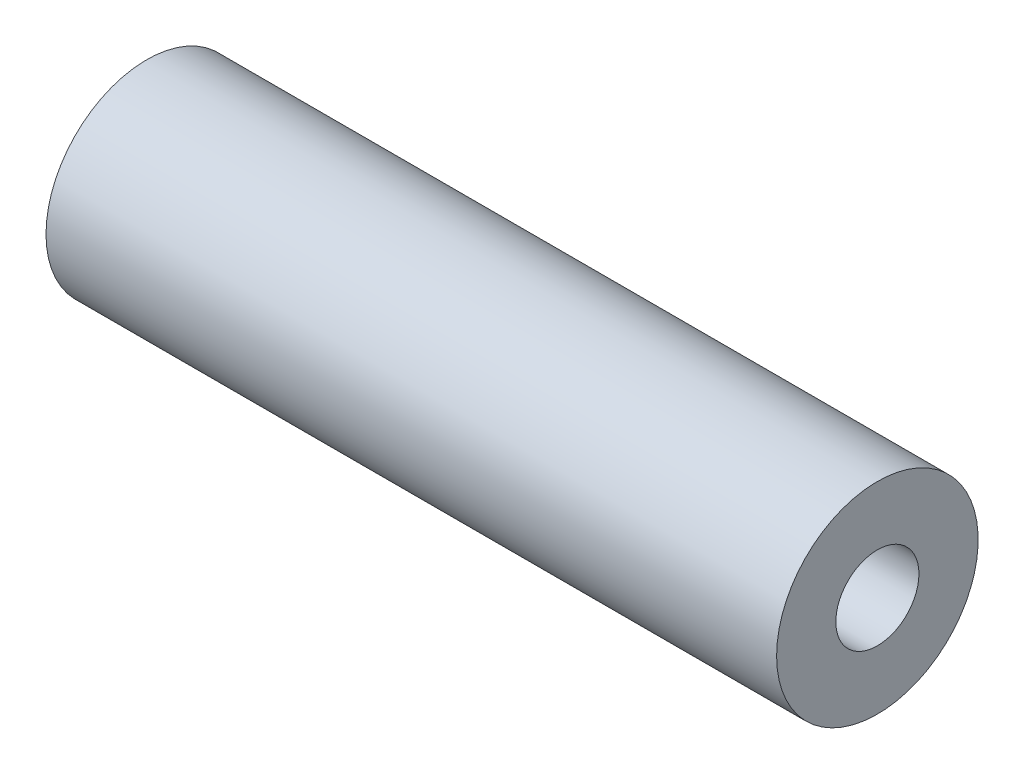
ISO-10303-21;
HEADER;
FILE_DESCRIPTION(('STEP AP214'),'2;1');
FILE_NAME('part.step','',(''),(''),'','','');
FILE_SCHEMA(('AUTOMOTIVE_DESIGN { 1 0 10303 214 1 1 1 1 }'));
ENDSEC;
DATA;
#1=APPLICATION_CONTEXT('core data for automotive mechanical design processes');
#2=APPLICATION_PROTOCOL_DEFINITION('international standard','automotive_design',2000,#1);
#3=PRODUCT_CONTEXT('',#1,'mechanical');
#4=PRODUCT('Part','Part','',(#3));
#5=PRODUCT_RELATED_PRODUCT_CATEGORY('part','',(#4));
#6=PRODUCT_DEFINITION_FORMATION('','',#4);
#7=PRODUCT_DEFINITION_CONTEXT('part definition',#1,'design');
#8=PRODUCT_DEFINITION('design','',#6,#7);
#9=PRODUCT_DEFINITION_SHAPE('','',#8);
#10=(LENGTH_UNIT() NAMED_UNIT(*) SI_UNIT(.MILLI.,.METRE.));
#11=(NAMED_UNIT(*) PLANE_ANGLE_UNIT() SI_UNIT($,.RADIAN.));
#12=(NAMED_UNIT(*) SI_UNIT($,.STERADIAN.) SOLID_ANGLE_UNIT());
#13=UNCERTAINTY_MEASURE_WITH_UNIT(LENGTH_MEASURE(1.E-05),#10,'distance_accuracy_value','');
#14=(GEOMETRIC_REPRESENTATION_CONTEXT(3) GLOBAL_UNCERTAINTY_ASSIGNED_CONTEXT((#13)) GLOBAL_UNIT_ASSIGNED_CONTEXT((#10,
#11,#12)) REPRESENTATION_CONTEXT('',''));
#15=CARTESIAN_POINT('',(0.,0.,0.));
#16=DIRECTION('',(0.,0.,1.));
#17=DIRECTION('',(1.,0.,0.));
#18=AXIS2_PLACEMENT_3D('',#15,#16,#17);
#19=CARTESIAN_POINT('',(14.5,0.,0.));
#20=DIRECTION('',(-1.,0.,0.));
#21=DIRECTION('',(0.,0.,1.));
#22=AXIS2_PLACEMENT_3D('',#19,#20,#21);
#23=CYLINDRICAL_SURFACE('',#22,4.);
#24=CARTESIAN_POINT('',(14.5,0.,0.));
#25=DIRECTION('',(1.,0.,0.));
#26=DIRECTION('',(0.,0.,-1.));
#27=AXIS2_PLACEMENT_3D('',#24,#25,#26);
#28=CIRCLE('',#27,4.);
#29=CARTESIAN_POINT('',(14.5,0.,4.));
#30=VERTEX_POINT('',#29);
#31=EDGE_CURVE('E10',#30,#30,#28,.T.);
#32=CARTESIAN_POINT('',(-14.5,0.,0.));
#33=DIRECTION('',(1.,0.,0.));
#34=DIRECTION('',(0.,0.,-1.));
#35=AXIS2_PLACEMENT_3D('',#32,#33,#34);
#36=CIRCLE('',#35,4.);
#37=CARTESIAN_POINT('',(-14.5,0.,4.));
#38=VERTEX_POINT('',#37);
#39=EDGE_CURVE('E45',#38,#38,#36,.T.);
#40=CARTESIAN_POINT('',(14.5,0.,4.));
#41=CARTESIAN_POINT('',(14.1979166666667,0.,4.));
#42=CARTESIAN_POINT('',(13.8958333333333,0.,4.));
#43=CARTESIAN_POINT('',(13.2916666666667,0.,4.));
#44=CARTESIAN_POINT('',(12.9895833333333,0.,4.));
#45=CARTESIAN_POINT('',(12.3854166666667,0.,4.));
#46=CARTESIAN_POINT('',(12.0833333333333,0.,4.));
#47=CARTESIAN_POINT('',(11.4791666666667,0.,4.));
#48=CARTESIAN_POINT('',(11.1770833333333,0.,4.));
#49=CARTESIAN_POINT('',(10.5729166666667,0.,4.));
#50=CARTESIAN_POINT('',(10.2708333333333,0.,4.));
#51=CARTESIAN_POINT('',(9.66666666666667,0.,4.));
#52=CARTESIAN_POINT('',(9.36458333333333,0.,4.));
#53=CARTESIAN_POINT('',(8.76041666666667,0.,4.));
#54=CARTESIAN_POINT('',(8.45833333333333,0.,4.));
#55=CARTESIAN_POINT('',(7.85416666666667,0.,4.));
#56=CARTESIAN_POINT('',(7.55208333333333,0.,4.));
#57=CARTESIAN_POINT('',(6.94791666666667,0.,4.));
#58=CARTESIAN_POINT('',(6.64583333333333,0.,4.));
#59=CARTESIAN_POINT('',(6.04166666666667,0.,4.));
#60=CARTESIAN_POINT('',(5.73958333333333,0.,4.));
#61=CARTESIAN_POINT('',(5.13541666666667,0.,4.));
#62=CARTESIAN_POINT('',(4.83333333333333,0.,4.));
#63=CARTESIAN_POINT('',(4.22916666666667,0.,4.));
#64=CARTESIAN_POINT('',(3.92708333333333,0.,4.));
#65=CARTESIAN_POINT('',(3.32291666666667,0.,4.));
#66=CARTESIAN_POINT('',(3.02083333333333,0.,4.));
#67=CARTESIAN_POINT('',(2.41666666666667,0.,4.));
#68=CARTESIAN_POINT('',(2.11458333333333,0.,4.));
#69=CARTESIAN_POINT('',(1.51041666666667,0.,4.));
#70=CARTESIAN_POINT('',(1.20833333333333,0.,4.));
#71=CARTESIAN_POINT('',(0.604166666666665,0.,4.));
#72=CARTESIAN_POINT('',(0.302083333333332,0.,4.));
#73=CARTESIAN_POINT('',(-0.302083333333335,0.,4.));
#74=CARTESIAN_POINT('',(-0.604166666666669,0.,4.));
#75=CARTESIAN_POINT('',(-1.20833333333333,0.,4.));
#76=CARTESIAN_POINT('',(-1.51041666666667,0.,4.));
#77=CARTESIAN_POINT('',(-2.11458333333333,0.,4.));
#78=CARTESIAN_POINT('',(-2.41666666666667,0.,4.));
#79=CARTESIAN_POINT('',(-3.02083333333333,0.,4.));
#80=CARTESIAN_POINT('',(-3.32291666666666,0.,4.));
#81=CARTESIAN_POINT('',(-3.92708333333333,0.,4.));
#82=CARTESIAN_POINT('',(-4.22916666666667,0.,4.));
#83=CARTESIAN_POINT('',(-4.83333333333333,0.,4.));
#84=CARTESIAN_POINT('',(-5.13541666666667,0.,4.));
#85=CARTESIAN_POINT('',(-5.73958333333333,0.,4.));
#86=CARTESIAN_POINT('',(-6.04166666666667,0.,4.));
#87=CARTESIAN_POINT('',(-6.64583333333333,0.,4.));
#88=CARTESIAN_POINT('',(-6.94791666666667,0.,4.));
#89=CARTESIAN_POINT('',(-7.55208333333333,0.,4.));
#90=CARTESIAN_POINT('',(-7.85416666666667,0.,4.));
#91=CARTESIAN_POINT('',(-8.45833333333333,0.,4.));
#92=CARTESIAN_POINT('',(-8.76041666666667,0.,4.));
#93=CARTESIAN_POINT('',(-9.36458333333333,0.,4.));
#94=CARTESIAN_POINT('',(-9.66666666666667,0.,4.));
#95=CARTESIAN_POINT('',(-10.2708333333333,0.,4.));
#96=CARTESIAN_POINT('',(-10.5729166666667,0.,4.));
#97=CARTESIAN_POINT('',(-11.1770833333333,0.,4.));
#98=CARTESIAN_POINT('',(-11.4791666666667,0.,4.));
#99=CARTESIAN_POINT('',(-12.0833333333333,0.,4.));
#100=CARTESIAN_POINT('',(-12.3854166666667,0.,4.));
#101=CARTESIAN_POINT('',(-12.9895833333333,0.,4.));
#102=CARTESIAN_POINT('',(-13.2916666666667,0.,4.));
#103=CARTESIAN_POINT('',(-13.8958333333333,0.,4.));
#104=CARTESIAN_POINT('',(-14.1979166666667,0.,4.));
#105=CARTESIAN_POINT('',(-14.5,0.,4.));
#106=B_SPLINE_CURVE_WITH_KNOTS('',3,(#40,#41,#42,#43,#44,#45,#46,#47,#48,#49,#50,#51,#52,#53,
#54,#55,#56,#57,#58,#59,#60,#61,#62,#63,#64,#65,#66,#67,#68,#69,#70,#71,#72,#73,#74,#75,#76,#77,
#78,#79,#80,#81,#82,#83,#84,#85,#86,#87,#88,#89,#90,#91,#92,#93,#94,#95,#96,#97,#98,#99,#100,
#101,#102,#103,#104,#105),.UNSPECIFIED.,.F.,.F.,(4,2,2,2,2,2,2,2,2,2,2,2,2,2,2,2,2,2,2,2,2,2,2,
2,2,2,2,2,2,2,2,2,4),(0.,0.906249999999999,1.8125,2.71875,3.625,4.53125,5.4375,6.34375,7.25,
8.15625,9.0625,9.96875,10.875,11.78125,12.6875,13.59375,14.5,15.40625,16.3125,17.21875,18.125,
19.03125,19.9375,20.84375,21.75,22.65625,23.5625,24.46875,25.375,26.28125,27.1875,28.09375,29.),.UNSPECIFIED.);
#107=EDGE_CURVE('BSEAM42',#30,#38,#106,.T.);
#108=ORIENTED_EDGE('',*,*,#31,.F.);
#109=ORIENTED_EDGE('',*,*,#39,.T.);
#110=ORIENTED_EDGE('',*,*,#107,.T.);
#111=ORIENTED_EDGE('',*,*,#107,.F.);
#112=EDGE_LOOP('',(#108,#110,#109,#111));
#113=FACE_BOUND('',#112,.T.);
#114=ADVANCED_FACE('F42',(#113),#23,.T.);
#115=CARTESIAN_POINT('',(14.5,0.,0.));
#116=DIRECTION('',(1.,0.,0.));
#117=DIRECTION('',(0.,0.,-1.));
#118=AXIS2_PLACEMENT_3D('',#115,#116,#117);
#119=PLANE('',#118);
#120=CARTESIAN_POINT('',(14.5,0.,0.));
#121=DIRECTION('',(1.,0.,0.));
#122=DIRECTION('',(0.,0.,-1.));
#123=AXIS2_PLACEMENT_3D('',#120,#121,#122);
#124=CIRCLE('',#123,1.65);
#125=CARTESIAN_POINT('',(14.5,0.,-1.65));
#126=VERTEX_POINT('',#125);
#127=EDGE_CURVE('E56',#126,#126,#124,.T.);
#128=ORIENTED_EDGE('',*,*,#127,.F.);
#129=EDGE_LOOP('',(#128));
#130=FACE_BOUND('',#129,.T.);
#131=ORIENTED_EDGE('',*,*,#31,.T.);
#132=EDGE_LOOP('',(#131));
#133=FACE_BOUND('',#132,.T.);
#134=ADVANCED_FACE('F62',(#130,#133),#119,.T.);
#135=CARTESIAN_POINT('',(-14.5,0.,0.));
#136=DIRECTION('',(1.,0.,0.));
#137=DIRECTION('',(0.,0.,-1.));
#138=AXIS2_PLACEMENT_3D('',#135,#136,#137);
#139=PLANE('',#138);
#140=CARTESIAN_POINT('',(-14.5,0.,0.));
#141=DIRECTION('',(1.,0.,0.));
#142=DIRECTION('',(0.,0.,-1.));
#143=AXIS2_PLACEMENT_3D('',#140,#141,#142);
#144=CIRCLE('',#143,1.65);
#145=CARTESIAN_POINT('',(-14.5,0.,-1.65));
#146=VERTEX_POINT('',#145);
#147=EDGE_CURVE('E52',#146,#146,#144,.T.);
#148=ORIENTED_EDGE('',*,*,#147,.T.);
#149=EDGE_LOOP('',(#148));
#150=FACE_BOUND('',#149,.T.);
#151=ORIENTED_EDGE('',*,*,#39,.F.);
#152=EDGE_LOOP('',(#151));
#153=FACE_BOUND('',#152,.T.);
#154=ADVANCED_FACE('F64',(#150,#153),#139,.F.);
#155=CARTESIAN_POINT('',(14.5,0.,0.));
#156=DIRECTION('',(1.,0.,0.));
#157=DIRECTION('',(0.,0.,-1.));
#158=AXIS2_PLACEMENT_3D('',#155,#156,#157);
#159=CYLINDRICAL_SURFACE('',#158,1.65);
#160=ORIENTED_EDGE('',*,*,#147,.F.);
#161=EDGE_LOOP('',(#160));
#162=FACE_BOUND('',#161,.T.);
#163=ORIENTED_EDGE('',*,*,#127,.T.);
#164=EDGE_LOOP('',(#163));
#165=FACE_BOUND('',#164,.T.);
#166=ADVANCED_FACE('F60',(#162,#165),#159,.F.);
#167=CLOSED_SHELL('',(#114,#134,#154,#166));
#168=MANIFOLD_SOLID_BREP('B2',#167);
#169=ADVANCED_BREP_SHAPE_REPRESENTATION('',(#18,#168),#14);
#170=SHAPE_DEFINITION_REPRESENTATION(#9,#169);
ENDSEC;
END-ISO-10303-21;
